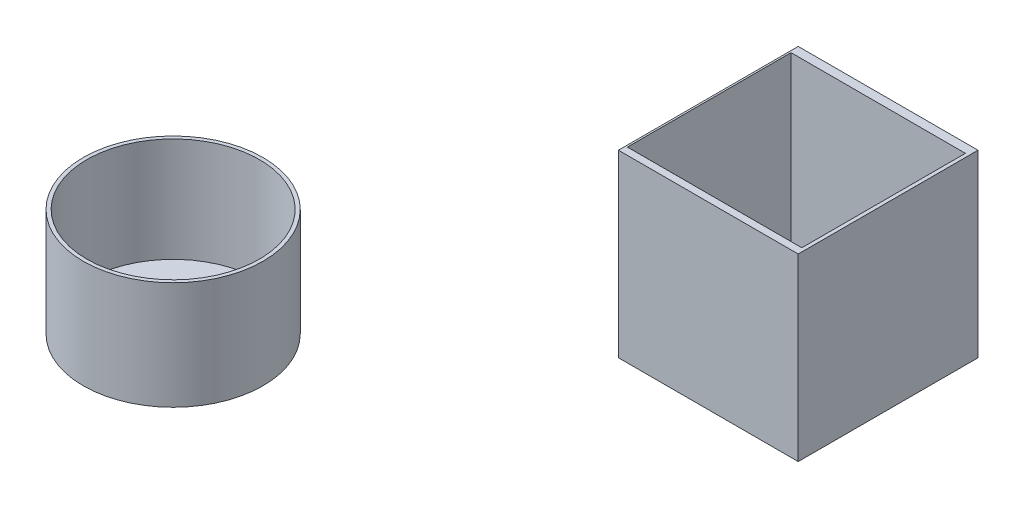
ISO-10303-21;
HEADER;
FILE_DESCRIPTION(('STEP AP214'),'2;1');
FILE_NAME('part.step','',(''),(''),'','','');
FILE_SCHEMA(('AUTOMOTIVE_DESIGN { 1 0 10303 214 1 1 1 1 }'));
ENDSEC;
DATA;
#1=APPLICATION_CONTEXT('core data for automotive mechanical design processes');
#2=APPLICATION_PROTOCOL_DEFINITION('international standard','automotive_design',2000,#1);
#3=PRODUCT_CONTEXT('',#1,'mechanical');
#4=PRODUCT('Part','Part','',(#3));
#5=PRODUCT_RELATED_PRODUCT_CATEGORY('part','',(#4));
#6=PRODUCT_DEFINITION_FORMATION('','',#4);
#7=PRODUCT_DEFINITION_CONTEXT('part definition',#1,'design');
#8=PRODUCT_DEFINITION('design','',#6,#7);
#9=PRODUCT_DEFINITION_SHAPE('','',#8);
#10=(LENGTH_UNIT() NAMED_UNIT(*) SI_UNIT(.MILLI.,.METRE.));
#11=(NAMED_UNIT(*) PLANE_ANGLE_UNIT() SI_UNIT($,.RADIAN.));
#12=(NAMED_UNIT(*) SI_UNIT($,.STERADIAN.) SOLID_ANGLE_UNIT());
#13=UNCERTAINTY_MEASURE_WITH_UNIT(LENGTH_MEASURE(1.E-05),#10,'distance_accuracy_value','');
#14=(GEOMETRIC_REPRESENTATION_CONTEXT(3) GLOBAL_UNCERTAINTY_ASSIGNED_CONTEXT((#13)) GLOBAL_UNIT_ASSIGNED_CONTEXT((#10,
#11,#12)) REPRESENTATION_CONTEXT('',''));
#15=CARTESIAN_POINT('',(0.,0.,0.));
#16=DIRECTION('',(0.,0.,1.));
#17=DIRECTION('',(1.,0.,0.));
#18=AXIS2_PLACEMENT_3D('',#15,#16,#17);
#19=CARTESIAN_POINT('',(235.338998585311,100.,-112.342028323724));
#20=DIRECTION('',(-1.,0.,0.));
#21=DIRECTION('',(0.,0.,1.));
#22=AXIS2_PLACEMENT_3D('',#19,#20,#21);
#23=PLANE('',#22);
#24=DIRECTION('',(0.,0.,-1.));
#25=VECTOR('',#24,1.);
#26=CARTESIAN_POINT('',(235.338998585311,0.,-112.342028323724));
#27=LINE('',#26,#25);
#28=CARTESIAN_POINT('',(235.338998585311,0.,-112.342028323724));
#29=VERTEX_POINT('',#28);
#30=CARTESIAN_POINT('',(235.338998585311,0.,-212.342028323724));
#31=VERTEX_POINT('',#30);
#32=EDGE_CURVE('E155',#29,#31,#27,.T.);
#33=ORIENTED_EDGE('',*,*,#32,.T.);
#34=DIRECTION('',(0.,-1.,0.));
#35=VECTOR('',#34,1.);
#36=CARTESIAN_POINT('',(235.338998585311,100.,-212.342028323724));
#37=LINE('',#36,#35);
#38=CARTESIAN_POINT('',(235.338998585311,100.,-212.342028323724));
#39=VERTEX_POINT('',#38);
#40=EDGE_CURVE('E12',#39,#31,#37,.T.);
#41=ORIENTED_EDGE('',*,*,#40,.F.);
#42=DIRECTION('',(0.,0.,-1.));
#43=VECTOR('',#42,1.);
#44=CARTESIAN_POINT('',(235.338998585311,100.,-112.342028323724));
#45=LINE('',#44,#43);
#46=CARTESIAN_POINT('',(235.338998585311,100.,-112.342028323724));
#47=VERTEX_POINT('',#46);
#48=EDGE_CURVE('E148',#47,#39,#45,.T.);
#49=ORIENTED_EDGE('',*,*,#48,.F.);
#50=DIRECTION('',(0.,-1.,0.));
#51=VECTOR('',#50,1.);
#52=CARTESIAN_POINT('',(235.338998585311,100.,-112.342028323724));
#53=LINE('',#52,#51);
#54=EDGE_CURVE('E154',#47,#29,#53,.T.);
#55=ORIENTED_EDGE('',*,*,#54,.T.);
#56=EDGE_LOOP('',(#33,#41,#49,#55));
#57=FACE_BOUND('',#56,.T.);
#58=ADVANCED_FACE('F41',(#57),#23,.F.);
#59=CARTESIAN_POINT('',(235.338998585311,100.,-212.342028323724));
#60=DIRECTION('',(0.,0.,1.));
#61=DIRECTION('',(1.,0.,0.));
#62=AXIS2_PLACEMENT_3D('',#59,#60,#61);
#63=PLANE('',#62);
#64=DIRECTION('',(-1.,0.,0.));
#65=VECTOR('',#64,1.);
#66=CARTESIAN_POINT('',(235.338998585311,0.,-212.342028323724));
#67=LINE('',#66,#65);
#68=CARTESIAN_POINT('',(135.338998585311,0.,-212.342028323724));
#69=VERTEX_POINT('',#68);
#70=EDGE_CURVE('E158',#31,#69,#67,.T.);
#71=ORIENTED_EDGE('',*,*,#70,.T.);
#72=DIRECTION('',(0.,-1.,0.));
#73=VECTOR('',#72,1.);
#74=CARTESIAN_POINT('',(135.338998585311,100.,-212.342028323724));
#75=LINE('',#74,#73);
#76=CARTESIAN_POINT('',(135.338998585311,100.,-212.342028323724));
#77=VERTEX_POINT('',#76);
#78=EDGE_CURVE('E48',#77,#69,#75,.T.);
#79=ORIENTED_EDGE('',*,*,#78,.F.);
#80=DIRECTION('',(-1.,0.,0.));
#81=VECTOR('',#80,1.);
#82=CARTESIAN_POINT('',(235.338998585311,100.,-212.342028323724));
#83=LINE('',#82,#81);
#84=EDGE_CURVE('E92',#39,#77,#83,.T.);
#85=ORIENTED_EDGE('',*,*,#84,.F.);
#86=ORIENTED_EDGE('',*,*,#40,.T.);
#87=EDGE_LOOP('',(#71,#79,#85,#86));
#88=FACE_BOUND('',#87,.T.);
#89=ADVANCED_FACE('F187',(#88),#63,.F.);
#90=CARTESIAN_POINT('',(135.338998585311,100.,-112.342028323724));
#91=DIRECTION('',(1.,0.,0.));
#92=DIRECTION('',(0.,0.,-1.));
#93=AXIS2_PLACEMENT_3D('',#90,#91,#92);
#94=PLANE('',#93);
#95=DIRECTION('',(0.,0.,1.));
#96=VECTOR('',#95,1.);
#97=CARTESIAN_POINT('',(135.338998585311,0.,-112.342028323724));
#98=LINE('',#97,#96);
#99=CARTESIAN_POINT('',(135.338998585311,0.,-112.342028323724));
#100=VERTEX_POINT('',#99);
#101=EDGE_CURVE('E160',#69,#100,#98,.T.);
#102=ORIENTED_EDGE('',*,*,#101,.T.);
#103=DIRECTION('',(0.,-1.,0.));
#104=VECTOR('',#103,1.);
#105=CARTESIAN_POINT('',(135.338998585311,100.,-112.342028323724));
#106=LINE('',#105,#104);
#107=CARTESIAN_POINT('',(135.338998585311,100.,-112.342028323724));
#108=VERTEX_POINT('',#107);
#109=EDGE_CURVE('E164',#108,#100,#106,.T.);
#110=ORIENTED_EDGE('',*,*,#109,.F.);
#111=DIRECTION('',(0.,0.,1.));
#112=VECTOR('',#111,1.);
#113=CARTESIAN_POINT('',(135.338998585311,100.,-112.342028323724));
#114=LINE('',#113,#112);
#115=EDGE_CURVE('E151',#77,#108,#114,.T.);
#116=ORIENTED_EDGE('',*,*,#115,.F.);
#117=ORIENTED_EDGE('',*,*,#78,.T.);
#118=EDGE_LOOP('',(#102,#110,#116,#117));
#119=FACE_BOUND('',#118,.T.);
#120=ADVANCED_FACE('F169',(#119),#94,.F.);
#121=CARTESIAN_POINT('',(235.338998585311,100.,-112.342028323724));
#122=DIRECTION('',(0.,0.,-1.));
#123=DIRECTION('',(-1.,0.,0.));
#124=AXIS2_PLACEMENT_3D('',#121,#122,#123);
#125=PLANE('',#124);
#126=DIRECTION('',(1.,0.,0.));
#127=VECTOR('',#126,1.);
#128=CARTESIAN_POINT('',(235.338998585311,0.,-112.342028323724));
#129=LINE('',#128,#127);
#130=EDGE_CURVE('E85',#100,#29,#129,.T.);
#131=ORIENTED_EDGE('',*,*,#130,.T.);
#132=ORIENTED_EDGE('',*,*,#54,.F.);
#133=DIRECTION('',(1.,0.,0.));
#134=VECTOR('',#133,1.);
#135=CARTESIAN_POINT('',(235.338998585311,100.,-112.342028323724));
#136=LINE('',#135,#134);
#137=EDGE_CURVE('E64',#108,#47,#136,.T.);
#138=ORIENTED_EDGE('',*,*,#137,.F.);
#139=ORIENTED_EDGE('',*,*,#109,.T.);
#140=EDGE_LOOP('',(#131,#132,#138,#139));
#141=FACE_BOUND('',#140,.T.);
#142=ADVANCED_FACE('F177',(#141),#125,.F.);
#143=CARTESIAN_POINT('',(0.,100.,0.));
#144=DIRECTION('',(0.,1.,0.));
#145=DIRECTION('',(0.,0.,1.));
#146=AXIS2_PLACEMENT_3D('',#143,#144,#145);
#147=PLANE('',#146);
#148=DIRECTION('',(0.,0.,-1.));
#149=VECTOR('',#148,1.);
#150=CARTESIAN_POINT('',(233.338998585311,100.,-112.342028323724));
#151=LINE('',#150,#149);
#152=CARTESIAN_POINT('',(233.338998585311,100.,-116.342028323724));
#153=VERTEX_POINT('',#152);
#154=CARTESIAN_POINT('',(233.338998585311,100.,-207.342028323724));
#155=VERTEX_POINT('',#154);
#156=EDGE_CURVE('E137',#153,#155,#151,.T.);
#157=ORIENTED_EDGE('',*,*,#156,.F.);
#158=DIRECTION('',(1.,0.,0.));
#159=VECTOR('',#158,1.);
#160=CARTESIAN_POINT('',(235.338998585311,100.,-116.342028323724));
#161=LINE('',#160,#159);
#162=CARTESIAN_POINT('',(136.338998585311,100.,-116.342028323724));
#163=VERTEX_POINT('',#162);
#164=EDGE_CURVE('E146',#163,#153,#161,.T.);
#165=ORIENTED_EDGE('',*,*,#164,.F.);
#166=DIRECTION('',(0.,0.,1.));
#167=VECTOR('',#166,1.);
#168=CARTESIAN_POINT('',(136.338998585311,100.,-112.342028323724));
#169=LINE('',#168,#167);
#170=CARTESIAN_POINT('',(136.338998585311,100.,-207.342028323724));
#171=VERTEX_POINT('',#170);
#172=EDGE_CURVE('E144',#171,#163,#169,.T.);
#173=ORIENTED_EDGE('',*,*,#172,.F.);
#174=DIRECTION('',(-1.,0.,0.));
#175=VECTOR('',#174,1.);
#176=CARTESIAN_POINT('',(235.338998585311,100.,-207.342028323724));
#177=LINE('',#176,#175);
#178=EDGE_CURVE('E129',#155,#171,#177,.T.);
#179=ORIENTED_EDGE('',*,*,#178,.F.);
#180=EDGE_LOOP('',(#157,#165,#173,#179));
#181=FACE_BOUND('',#180,.T.);
#182=ORIENTED_EDGE('',*,*,#48,.T.);
#183=ORIENTED_EDGE('',*,*,#84,.T.);
#184=ORIENTED_EDGE('',*,*,#115,.T.);
#185=ORIENTED_EDGE('',*,*,#137,.T.);
#186=EDGE_LOOP('',(#182,#183,#184,#185));
#187=FACE_BOUND('',#186,.T.);
#188=ADVANCED_FACE('F179',(#181,#187),#147,.T.);
#189=CARTESIAN_POINT('',(0.,0.,0.));
#190=DIRECTION('',(0.,1.,0.));
#191=DIRECTION('',(0.,0.,1.));
#192=AXIS2_PLACEMENT_3D('',#189,#190,#191);
#193=PLANE('',#192);
#194=ORIENTED_EDGE('',*,*,#32,.F.);
#195=ORIENTED_EDGE('',*,*,#130,.F.);
#196=ORIENTED_EDGE('',*,*,#101,.F.);
#197=ORIENTED_EDGE('',*,*,#70,.F.);
#198=EDGE_LOOP('',(#194,#195,#196,#197));
#199=FACE_BOUND('',#198,.T.);
#200=ADVANCED_FACE('F173',(#199),#193,.F.);
#201=CARTESIAN_POINT('',(233.338998585311,100.,-112.342028323724));
#202=DIRECTION('',(-1.,0.,0.));
#203=DIRECTION('',(0.,0.,1.));
#204=AXIS2_PLACEMENT_3D('',#201,#202,#203);
#205=PLANE('',#204);
#206=DIRECTION('',(0.,0.,-1.));
#207=VECTOR('',#206,1.);
#208=CARTESIAN_POINT('',(233.338998585311,2.,-112.342028323724));
#209=LINE('',#208,#207);
#210=CARTESIAN_POINT('',(233.338998585311,2.,-116.342028323724));
#211=VERTEX_POINT('',#210);
#212=CARTESIAN_POINT('',(233.338998585311,2.,-207.342028323724));
#213=VERTEX_POINT('',#212);
#214=EDGE_CURVE('E120',#211,#213,#209,.T.);
#215=ORIENTED_EDGE('',*,*,#214,.F.);
#216=DIRECTION('',(0.,-1.,0.));
#217=VECTOR('',#216,1.);
#218=CARTESIAN_POINT('',(233.338998585311,100.,-116.342028323724));
#219=LINE('',#218,#217);
#220=EDGE_CURVE('E140',#153,#211,#219,.T.);
#221=ORIENTED_EDGE('',*,*,#220,.F.);
#222=ORIENTED_EDGE('',*,*,#156,.T.);
#223=DIRECTION('',(0.,-1.,0.));
#224=VECTOR('',#223,1.);
#225=CARTESIAN_POINT('',(233.338998585311,100.,-207.342028323724));
#226=LINE('',#225,#224);
#227=EDGE_CURVE('E132',#155,#213,#226,.T.);
#228=ORIENTED_EDGE('',*,*,#227,.T.);
#229=EDGE_LOOP('',(#215,#221,#222,#228));
#230=FACE_BOUND('',#229,.T.);
#231=ADVANCED_FACE('F214',(#230),#205,.T.);
#232=CARTESIAN_POINT('',(235.338998585311,100.,-207.342028323724));
#233=DIRECTION('',(0.,0.,1.));
#234=DIRECTION('',(1.,0.,0.));
#235=AXIS2_PLACEMENT_3D('',#232,#233,#234);
#236=PLANE('',#235);
#237=DIRECTION('',(-1.,0.,0.));
#238=VECTOR('',#237,1.);
#239=CARTESIAN_POINT('',(235.338998585311,2.,-207.342028323724));
#240=LINE('',#239,#238);
#241=CARTESIAN_POINT('',(136.338998585311,2.,-207.342028323724));
#242=VERTEX_POINT('',#241);
#243=EDGE_CURVE('E114',#213,#242,#240,.T.);
#244=ORIENTED_EDGE('',*,*,#243,.F.);
#245=ORIENTED_EDGE('',*,*,#227,.F.);
#246=ORIENTED_EDGE('',*,*,#178,.T.);
#247=DIRECTION('',(0.,-1.,0.));
#248=VECTOR('',#247,1.);
#249=CARTESIAN_POINT('',(136.338998585311,100.,-207.342028323724));
#250=LINE('',#249,#248);
#251=EDGE_CURVE('E126',#171,#242,#250,.T.);
#252=ORIENTED_EDGE('',*,*,#251,.T.);
#253=EDGE_LOOP('',(#244,#245,#246,#252));
#254=FACE_BOUND('',#253,.T.);
#255=ADVANCED_FACE('F127',(#254),#236,.T.);
#256=CARTESIAN_POINT('',(136.338998585311,100.,-112.342028323724));
#257=DIRECTION('',(1.,0.,0.));
#258=DIRECTION('',(0.,0.,-1.));
#259=AXIS2_PLACEMENT_3D('',#256,#257,#258);
#260=PLANE('',#259);
#261=DIRECTION('',(0.,0.,1.));
#262=VECTOR('',#261,1.);
#263=CARTESIAN_POINT('',(136.338998585311,2.,-112.342028323724));
#264=LINE('',#263,#262);
#265=CARTESIAN_POINT('',(136.338998585311,2.,-116.342028323724));
#266=VERTEX_POINT('',#265);
#267=EDGE_CURVE('E118',#242,#266,#264,.T.);
#268=ORIENTED_EDGE('',*,*,#267,.F.);
#269=ORIENTED_EDGE('',*,*,#251,.F.);
#270=ORIENTED_EDGE('',*,*,#172,.T.);
#271=DIRECTION('',(0.,-1.,0.));
#272=VECTOR('',#271,1.);
#273=CARTESIAN_POINT('',(136.338998585311,100.,-116.342028323724));
#274=LINE('',#273,#272);
#275=EDGE_CURVE('E55',#163,#266,#274,.T.);
#276=ORIENTED_EDGE('',*,*,#275,.T.);
#277=EDGE_LOOP('',(#268,#269,#270,#276));
#278=FACE_BOUND('',#277,.T.);
#279=ADVANCED_FACE('F134',(#278),#260,.T.);
#280=CARTESIAN_POINT('',(235.338998585311,100.,-116.342028323724));
#281=DIRECTION('',(0.,0.,-1.));
#282=DIRECTION('',(-1.,0.,0.));
#283=AXIS2_PLACEMENT_3D('',#280,#281,#282);
#284=PLANE('',#283);
#285=DIRECTION('',(1.,0.,0.));
#286=VECTOR('',#285,1.);
#287=CARTESIAN_POINT('',(235.338998585311,2.,-116.342028323724));
#288=LINE('',#287,#286);
#289=EDGE_CURVE('E135',#266,#211,#288,.T.);
#290=ORIENTED_EDGE('',*,*,#289,.F.);
#291=ORIENTED_EDGE('',*,*,#275,.F.);
#292=ORIENTED_EDGE('',*,*,#164,.T.);
#293=ORIENTED_EDGE('',*,*,#220,.T.);
#294=EDGE_LOOP('',(#290,#291,#292,#293));
#295=FACE_BOUND('',#294,.T.);
#296=ADVANCED_FACE('F244',(#295),#284,.T.);
#297=CARTESIAN_POINT('',(0.,2.,0.));
#298=DIRECTION('',(0.,1.,0.));
#299=DIRECTION('',(0.,0.,1.));
#300=AXIS2_PLACEMENT_3D('',#297,#298,#299);
#301=PLANE('',#300);
#302=ORIENTED_EDGE('',*,*,#214,.T.);
#303=ORIENTED_EDGE('',*,*,#243,.T.);
#304=ORIENTED_EDGE('',*,*,#267,.T.);
#305=ORIENTED_EDGE('',*,*,#289,.T.);
#306=EDGE_LOOP('',(#302,#303,#304,#305));
#307=FACE_BOUND('',#306,.T.);
#308=ADVANCED_FACE('F116',(#307),#301,.T.);
#309=CLOSED_SHELL('',(#58,#89,#120,#142,#188,#200,#231,#255,#279,#296,#308));
#310=MANIFOLD_SOLID_BREP('B2',#309);
#311=CARTESIAN_POINT('',(0.,60.,0.));
#312=DIRECTION('',(0.,-1.,0.));
#313=DIRECTION('',(0.,0.,-1.));
#314=AXIS2_PLACEMENT_3D('',#311,#312,#313);
#315=CYLINDRICAL_SURFACE('',#314,50.);
#316=CARTESIAN_POINT('',(0.,60.,0.));
#317=DIRECTION('',(0.,1.,0.));
#318=DIRECTION('',(0.,0.,1.));
#319=AXIS2_PLACEMENT_3D('',#316,#317,#318);
#320=CIRCLE('',#319,50.);
#321=CARTESIAN_POINT('',(0.,60.,50.));
#322=VERTEX_POINT('',#321);
#323=EDGE_CURVE('E40',#322,#322,#320,.T.);
#324=ORIENTED_EDGE('',*,*,#323,.F.);
#325=EDGE_LOOP('',(#324));
#326=FACE_BOUND('',#325,.T.);
#327=CARTESIAN_POINT('',(0.,0.,0.));
#328=DIRECTION('',(0.,1.,0.));
#329=DIRECTION('',(0.,0.,1.));
#330=AXIS2_PLACEMENT_3D('',#327,#328,#329);
#331=CIRCLE('',#330,50.);
#332=CARTESIAN_POINT('',(0.,0.,50.));
#333=VERTEX_POINT('',#332);
#334=EDGE_CURVE('E283',#333,#333,#331,.T.);
#335=ORIENTED_EDGE('',*,*,#334,.T.);
#336=EDGE_LOOP('',(#335));
#337=FACE_BOUND('',#336,.T.);
#338=ADVANCED_FACE('F280',(#326,#337),#315,.T.);
#339=CARTESIAN_POINT('',(0.,60.,0.));
#340=DIRECTION('',(0.,1.,0.));
#341=DIRECTION('',(0.,0.,1.));
#342=AXIS2_PLACEMENT_3D('',#339,#340,#341);
#343=PLANE('',#342);
#344=CARTESIAN_POINT('',(0.,60.,0.));
#345=DIRECTION('',(0.,1.,0.));
#346=DIRECTION('',(0.,0.,1.));
#347=AXIS2_PLACEMENT_3D('',#344,#345,#346);
#348=CIRCLE('',#347,48.);
#349=CARTESIAN_POINT('',(0.,60.,48.));
#350=VERTEX_POINT('',#349);
#351=EDGE_CURVE('E290',#350,#350,#348,.T.);
#352=ORIENTED_EDGE('',*,*,#351,.F.);
#353=EDGE_LOOP('',(#352));
#354=FACE_BOUND('',#353,.T.);
#355=ORIENTED_EDGE('',*,*,#323,.T.);
#356=EDGE_LOOP('',(#355));
#357=FACE_BOUND('',#356,.T.);
#358=ADVANCED_FACE('F310',(#354,#357),#343,.T.);
#359=CARTESIAN_POINT('',(0.,0.,0.));
#360=DIRECTION('',(0.,1.,0.));
#361=DIRECTION('',(0.,0.,1.));
#362=AXIS2_PLACEMENT_3D('',#359,#360,#361);
#363=PLANE('',#362);
#364=ORIENTED_EDGE('',*,*,#334,.F.);
#365=EDGE_LOOP('',(#364));
#366=FACE_BOUND('',#365,.T.);
#367=ADVANCED_FACE('F302',(#366),#363,.F.);
#368=CARTESIAN_POINT('',(0.,60.,0.));
#369=DIRECTION('',(0.,-1.,0.));
#370=DIRECTION('',(0.,0.,-1.));
#371=AXIS2_PLACEMENT_3D('',#368,#369,#370);
#372=CYLINDRICAL_SURFACE('',#371,48.);
#373=ORIENTED_EDGE('',*,*,#351,.T.);
#374=EDGE_LOOP('',(#373));
#375=FACE_BOUND('',#374,.T.);
#376=CARTESIAN_POINT('',(0.,2.,0.));
#377=DIRECTION('',(0.,1.,0.));
#378=DIRECTION('',(0.,0.,1.));
#379=AXIS2_PLACEMENT_3D('',#376,#377,#378);
#380=CIRCLE('',#379,48.);
#381=CARTESIAN_POINT('',(0.,2.,48.));
#382=VERTEX_POINT('',#381);
#383=EDGE_CURVE('E294',#382,#382,#380,.T.);
#384=ORIENTED_EDGE('',*,*,#383,.F.);
#385=EDGE_LOOP('',(#384));
#386=FACE_BOUND('',#385,.T.);
#387=ADVANCED_FACE('F300',(#375,#386),#372,.F.);
#388=CARTESIAN_POINT('',(0.,2.,0.));
#389=DIRECTION('',(0.,1.,0.));
#390=DIRECTION('',(0.,0.,1.));
#391=AXIS2_PLACEMENT_3D('',#388,#389,#390);
#392=PLANE('',#391);
#393=ORIENTED_EDGE('',*,*,#383,.T.);
#394=EDGE_LOOP('',(#393));
#395=FACE_BOUND('',#394,.T.);
#396=ADVANCED_FACE('F298',(#395),#392,.T.);
#397=CLOSED_SHELL('',(#338,#358,#367,#387,#396));
#398=MANIFOLD_SOLID_BREP('B6',#397);
#399=ADVANCED_BREP_SHAPE_REPRESENTATION('',(#18,#310,#398),#14);
#400=SHAPE_DEFINITION_REPRESENTATION(#9,#399);
ENDSEC;
END-ISO-10303-21;
